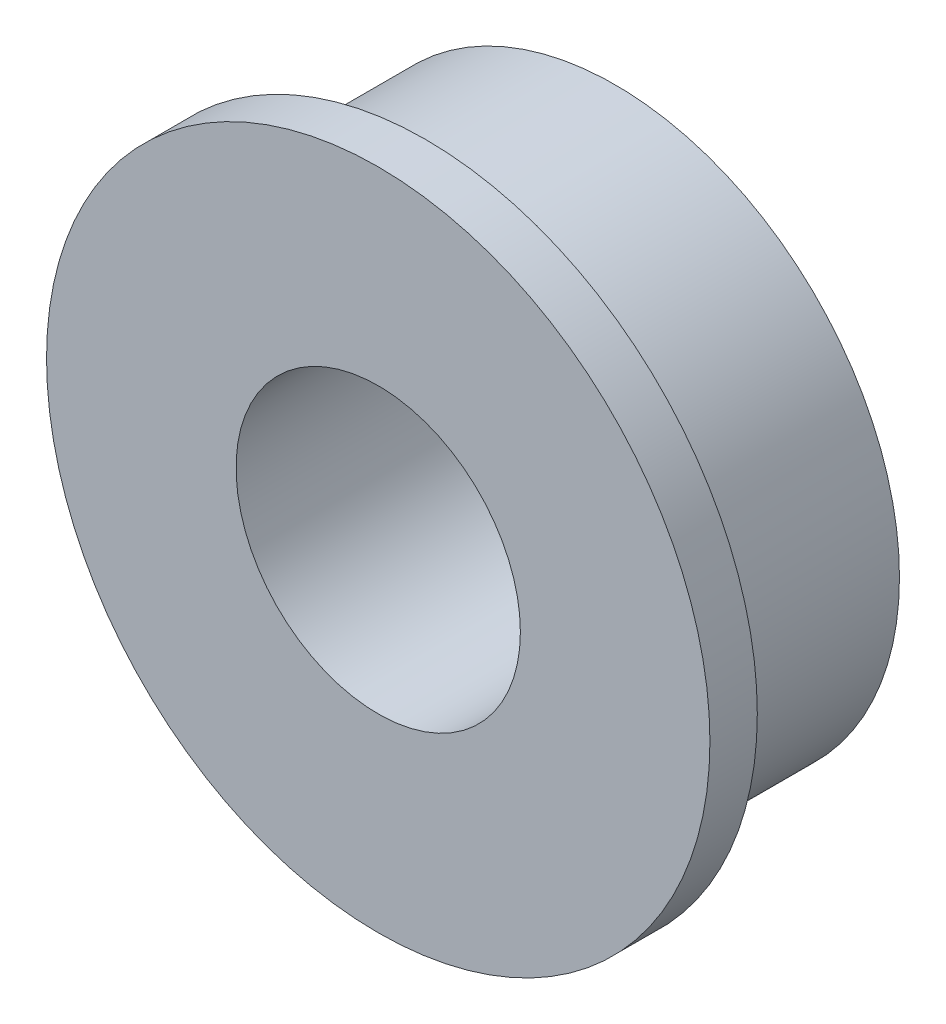
ISO-10303-21;
HEADER;
FILE_DESCRIPTION(('STEP AP214'),'2;1');
FILE_NAME('part.step','',(''),(''),'','','');
FILE_SCHEMA(('AUTOMOTIVE_DESIGN { 1 0 10303 214 1 1 1 1 }'));
ENDSEC;
DATA;
#1=APPLICATION_CONTEXT('core data for automotive mechanical design processes');
#2=APPLICATION_PROTOCOL_DEFINITION('international standard','automotive_design',2000,#1);
#3=PRODUCT_CONTEXT('',#1,'mechanical');
#4=PRODUCT('Part','Part','',(#3));
#5=PRODUCT_RELATED_PRODUCT_CATEGORY('part','',(#4));
#6=PRODUCT_DEFINITION_FORMATION('','',#4);
#7=PRODUCT_DEFINITION_CONTEXT('part definition',#1,'design');
#8=PRODUCT_DEFINITION('design','',#6,#7);
#9=PRODUCT_DEFINITION_SHAPE('','',#8);
#10=(LENGTH_UNIT() NAMED_UNIT(*) SI_UNIT(.MILLI.,.METRE.));
#11=(NAMED_UNIT(*) PLANE_ANGLE_UNIT() SI_UNIT($,.RADIAN.));
#12=(NAMED_UNIT(*) SI_UNIT($,.STERADIAN.) SOLID_ANGLE_UNIT());
#13=UNCERTAINTY_MEASURE_WITH_UNIT(LENGTH_MEASURE(1.E-05),#10,'distance_accuracy_value','');
#14=(GEOMETRIC_REPRESENTATION_CONTEXT(3) GLOBAL_UNCERTAINTY_ASSIGNED_CONTEXT((#13)) GLOBAL_UNIT_ASSIGNED_CONTEXT((#10,
#11,#12)) REPRESENTATION_CONTEXT('',''));
#15=CARTESIAN_POINT('',(0.,0.,0.));
#16=DIRECTION('',(0.,0.,1.));
#17=DIRECTION('',(1.,0.,0.));
#18=AXIS2_PLACEMENT_3D('',#15,#16,#17);
#19=CARTESIAN_POINT('',(0.,0.,0.));
#20=DIRECTION('',(0.,0.,1.));
#21=DIRECTION('',(1.,0.,0.));
#22=AXIS2_PLACEMENT_3D('',#19,#20,#21);
#23=PLANE('',#22);
#24=CARTESIAN_POINT('',(0.,0.,0.));
#25=DIRECTION('',(0.,0.,1.));
#26=DIRECTION('',(1.,0.,0.));
#27=AXIS2_PLACEMENT_3D('',#24,#25,#26);
#28=CIRCLE('',#27,3.);
#29=CARTESIAN_POINT('',(3.,0.,0.));
#30=VERTEX_POINT('',#29);
#31=EDGE_CURVE('E38',#30,#30,#28,.T.);
#32=ORIENTED_EDGE('',*,*,#31,.F.);
#33=EDGE_LOOP('',(#32));
#34=FACE_BOUND('',#33,.T.);
#35=CARTESIAN_POINT('',(0.,0.,0.));
#36=DIRECTION('',(0.,0.,1.));
#37=DIRECTION('',(1.,0.,0.));
#38=AXIS2_PLACEMENT_3D('',#35,#36,#37);
#39=CIRCLE('',#38,1.5);
#40=CARTESIAN_POINT('',(1.5,0.,0.));
#41=VERTEX_POINT('',#40);
#42=EDGE_CURVE('E45',#41,#41,#39,.T.);
#43=ORIENTED_EDGE('',*,*,#42,.T.);
#44=EDGE_LOOP('',(#43));
#45=FACE_BOUND('',#44,.T.);
#46=ADVANCED_FACE('F34',(#34,#45),#23,.F.);
#47=CARTESIAN_POINT('',(0.,0.,2.));
#48=DIRECTION('',(0.,0.,-1.));
#49=DIRECTION('',(-1.,0.,0.));
#50=AXIS2_PLACEMENT_3D('',#47,#48,#49);
#51=CYLINDRICAL_SURFACE('',#50,3.);
#52=CARTESIAN_POINT('',(0.,0.,2.));
#53=DIRECTION('',(0.,0.,1.));
#54=DIRECTION('',(1.,0.,0.));
#55=AXIS2_PLACEMENT_3D('',#52,#53,#54);
#56=CIRCLE('',#55,3.);
#57=CARTESIAN_POINT('',(3.,0.,2.));
#58=VERTEX_POINT('',#57);
#59=EDGE_CURVE('E10',#58,#58,#56,.T.);
#60=ORIENTED_EDGE('',*,*,#59,.F.);
#61=EDGE_LOOP('',(#60));
#62=FACE_BOUND('',#61,.T.);
#63=ORIENTED_EDGE('',*,*,#31,.T.);
#64=EDGE_LOOP('',(#63));
#65=FACE_BOUND('',#64,.T.);
#66=ADVANCED_FACE('F36',(#62,#65),#51,.T.);
#67=CARTESIAN_POINT('',(0.,0.,2.));
#68=DIRECTION('',(0.,0.,-1.));
#69=DIRECTION('',(-1.,0.,0.));
#70=AXIS2_PLACEMENT_3D('',#67,#68,#69);
#71=CYLINDRICAL_SURFACE('',#70,1.5);
#72=ORIENTED_EDGE('',*,*,#42,.F.);
#73=EDGE_LOOP('',(#72));
#74=FACE_BOUND('',#73,.T.);
#75=CARTESIAN_POINT('',(0.,0.,2.5));
#76=DIRECTION('',(0.,0.,1.));
#77=DIRECTION('',(1.,0.,0.));
#78=AXIS2_PLACEMENT_3D('',#75,#76,#77);
#79=CIRCLE('',#78,1.5);
#80=CARTESIAN_POINT('',(1.5,0.,2.5));
#81=VERTEX_POINT('',#80);
#82=EDGE_CURVE('E53',#81,#81,#79,.T.);
#83=ORIENTED_EDGE('',*,*,#82,.T.);
#84=EDGE_LOOP('',(#83));
#85=FACE_BOUND('',#84,.T.);
#86=ADVANCED_FACE('F59',(#74,#85),#71,.F.);
#87=CARTESIAN_POINT('',(0.,0.,2.5));
#88=DIRECTION('',(0.,0.,1.));
#89=DIRECTION('',(1.,0.,0.));
#90=AXIS2_PLACEMENT_3D('',#87,#88,#89);
#91=PLANE('',#90);
#92=CARTESIAN_POINT('',(0.,0.,2.5));
#93=DIRECTION('',(0.,0.,1.));
#94=DIRECTION('',(1.,0.,0.));
#95=AXIS2_PLACEMENT_3D('',#92,#93,#94);
#96=CIRCLE('',#95,3.5);
#97=CARTESIAN_POINT('',(3.5,0.,2.5));
#98=VERTEX_POINT('',#97);
#99=EDGE_CURVE('E49',#98,#98,#96,.T.);
#100=ORIENTED_EDGE('',*,*,#99,.T.);
#101=EDGE_LOOP('',(#100));
#102=FACE_BOUND('',#101,.T.);
#103=ORIENTED_EDGE('',*,*,#82,.F.);
#104=EDGE_LOOP('',(#103));
#105=FACE_BOUND('',#104,.T.);
#106=ADVANCED_FACE('F61',(#102,#105),#91,.T.);
#107=CARTESIAN_POINT('',(0.,0.,2.));
#108=DIRECTION('',(0.,0.,1.));
#109=DIRECTION('',(1.,0.,0.));
#110=AXIS2_PLACEMENT_3D('',#107,#108,#109);
#111=PLANE('',#110);
#112=ORIENTED_EDGE('',*,*,#59,.T.);
#113=EDGE_LOOP('',(#112));
#114=FACE_BOUND('',#113,.T.);
#115=CARTESIAN_POINT('',(0.,0.,2.));
#116=DIRECTION('',(0.,0.,1.));
#117=DIRECTION('',(1.,0.,0.));
#118=AXIS2_PLACEMENT_3D('',#115,#116,#117);
#119=CIRCLE('',#118,3.5);
#120=CARTESIAN_POINT('',(3.5,0.,2.));
#121=VERTEX_POINT('',#120);
#122=EDGE_CURVE('E50',#121,#121,#119,.T.);
#123=ORIENTED_EDGE('',*,*,#122,.F.);
#124=EDGE_LOOP('',(#123));
#125=FACE_BOUND('',#124,.T.);
#126=ADVANCED_FACE('F63',(#114,#125),#111,.F.);
#127=CARTESIAN_POINT('',(0.,0.,2.5));
#128=DIRECTION('',(0.,0.,-1.));
#129=DIRECTION('',(-1.,0.,0.));
#130=AXIS2_PLACEMENT_3D('',#127,#128,#129);
#131=CYLINDRICAL_SURFACE('',#130,3.5);
#132=ORIENTED_EDGE('',*,*,#99,.F.);
#133=EDGE_LOOP('',(#132));
#134=FACE_BOUND('',#133,.T.);
#135=ORIENTED_EDGE('',*,*,#122,.T.);
#136=EDGE_LOOP('',(#135));
#137=FACE_BOUND('',#136,.T.);
#138=ADVANCED_FACE('F70',(#134,#137),#131,.T.);
#139=CLOSED_SHELL('',(#46,#66,#86,#106,#126,#138));
#140=MANIFOLD_SOLID_BREP('B2',#139);
#141=ADVANCED_BREP_SHAPE_REPRESENTATION('',(#18,#140),#14);
#142=SHAPE_DEFINITION_REPRESENTATION(#9,#141);
ENDSEC;
END-ISO-10303-21;
